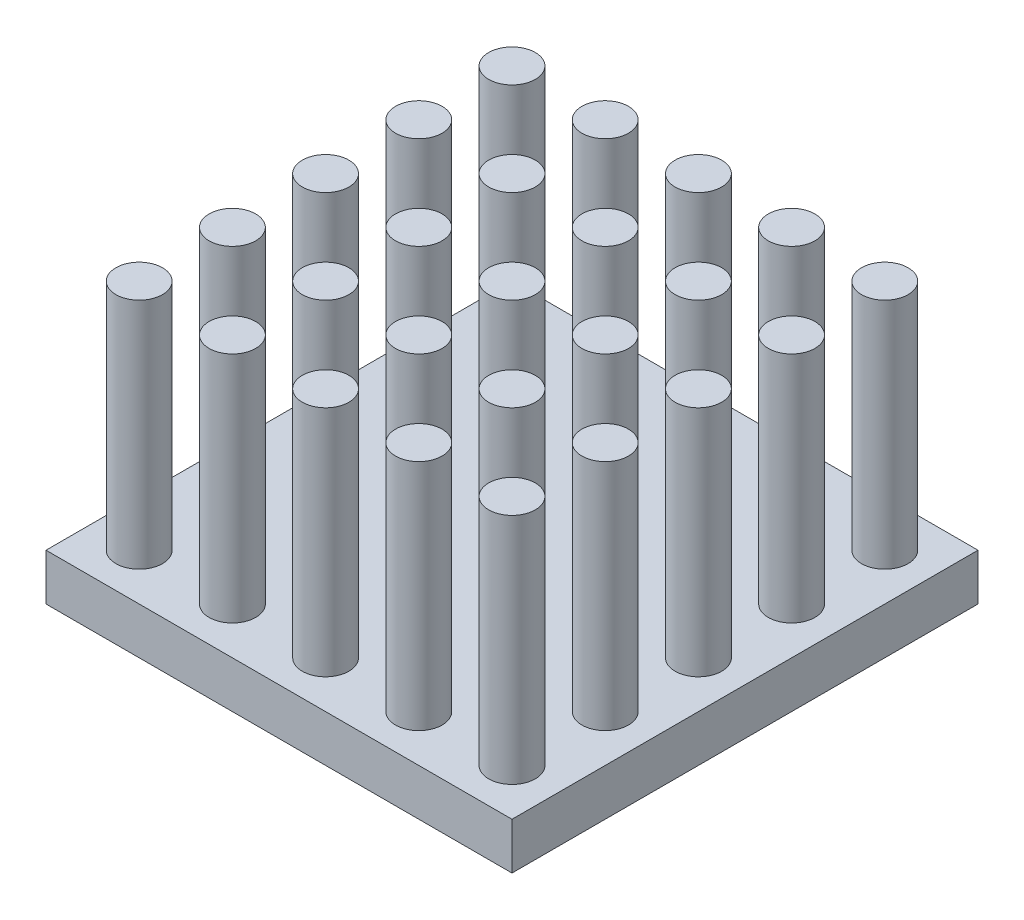
ISO-10303-21;
HEADER;
FILE_DESCRIPTION(('STEP AP214'),'2;1');
FILE_NAME('part.step','',(''),(''),'','','');
FILE_SCHEMA(('AUTOMOTIVE_DESIGN { 1 0 10303 214 1 1 1 1 }'));
ENDSEC;
DATA;
#1=APPLICATION_CONTEXT('core data for automotive mechanical design processes');
#2=APPLICATION_PROTOCOL_DEFINITION('international standard','automotive_design',2000,#1);
#3=PRODUCT_CONTEXT('',#1,'mechanical');
#4=PRODUCT('Part','Part','',(#3));
#5=PRODUCT_RELATED_PRODUCT_CATEGORY('part','',(#4));
#6=PRODUCT_DEFINITION_FORMATION('','',#4);
#7=PRODUCT_DEFINITION_CONTEXT('part definition',#1,'design');
#8=PRODUCT_DEFINITION('design','',#6,#7);
#9=PRODUCT_DEFINITION_SHAPE('','',#8);
#10=(LENGTH_UNIT() NAMED_UNIT(*) SI_UNIT(.MILLI.,.METRE.));
#11=(NAMED_UNIT(*) PLANE_ANGLE_UNIT() SI_UNIT($,.RADIAN.));
#12=(NAMED_UNIT(*) SI_UNIT($,.STERADIAN.) SOLID_ANGLE_UNIT());
#13=UNCERTAINTY_MEASURE_WITH_UNIT(LENGTH_MEASURE(1.E-05),#10,'distance_accuracy_value','');
#14=(GEOMETRIC_REPRESENTATION_CONTEXT(3) GLOBAL_UNCERTAINTY_ASSIGNED_CONTEXT((#13)) GLOBAL_UNIT_ASSIGNED_CONTEXT((#10,
#11,#12)) REPRESENTATION_CONTEXT('',''));
#15=CARTESIAN_POINT('',(0.,0.,0.));
#16=DIRECTION('',(0.,0.,1.));
#17=DIRECTION('',(1.,0.,0.));
#18=AXIS2_PLACEMENT_3D('',#15,#16,#17);
#19=CARTESIAN_POINT('',(0.,6.,4.));
#20=DIRECTION('',(0.,-1.,0.));
#21=DIRECTION('',(0.,0.,-1.));
#22=AXIS2_PLACEMENT_3D('',#19,#20,#21);
#23=CYLINDRICAL_SURFACE('',#22,0.5);
#24=CARTESIAN_POINT('',(0.,6.,4.));
#25=DIRECTION('',(0.,1.,0.));
#26=DIRECTION('',(0.,0.,1.));
#27=AXIS2_PLACEMENT_3D('',#24,#25,#26);
#28=CIRCLE('',#27,0.5);
#29=CARTESIAN_POINT('',(0.,6.,4.5));
#30=VERTEX_POINT('',#29);
#31=EDGE_CURVE('E11',#30,#30,#28,.T.);
#32=ORIENTED_EDGE('',*,*,#31,.F.);
#33=EDGE_LOOP('',(#32));
#34=FACE_BOUND('',#33,.T.);
#35=CARTESIAN_POINT('',(0.,1.,4.));
#36=DIRECTION('',(0.,-1.,0.));
#37=DIRECTION('',(0.,0.,-1.));
#38=AXIS2_PLACEMENT_3D('',#35,#36,#37);
#39=CIRCLE('',#38,0.5);
#40=CARTESIAN_POINT('',(0.,1.,3.5));
#41=VERTEX_POINT('',#40);
#42=EDGE_CURVE('E48',#41,#41,#39,.F.);
#43=ORIENTED_EDGE('',*,*,#42,.T.);
#44=EDGE_LOOP('',(#43));
#45=FACE_BOUND('',#44,.T.);
#46=ADVANCED_FACE('F40',(#34,#45),#23,.T.);
#47=CARTESIAN_POINT('',(0.,6.,4.));
#48=DIRECTION('',(0.,1.,0.));
#49=DIRECTION('',(0.,0.,1.));
#50=AXIS2_PLACEMENT_3D('',#47,#48,#49);
#51=PLANE('',#50);
#52=ORIENTED_EDGE('',*,*,#31,.T.);
#53=EDGE_LOOP('',(#52));
#54=FACE_BOUND('',#53,.T.);
#55=ADVANCED_FACE('F263',(#54),#51,.T.);
#56=CARTESIAN_POINT('',(0.,6.,2.));
#57=DIRECTION('',(0.,-1.,0.));
#58=DIRECTION('',(0.,0.,-1.));
#59=AXIS2_PLACEMENT_3D('',#56,#57,#58);
#60=CYLINDRICAL_SURFACE('',#59,0.5);
#61=CARTESIAN_POINT('',(0.,6.,2.));
#62=DIRECTION('',(0.,1.,0.));
#63=DIRECTION('',(0.,0.,1.));
#64=AXIS2_PLACEMENT_3D('',#61,#62,#63);
#65=CIRCLE('',#64,0.5);
#66=CARTESIAN_POINT('',(0.,6.,2.5));
#67=VERTEX_POINT('',#66);
#68=EDGE_CURVE('E241',#67,#67,#65,.T.);
#69=ORIENTED_EDGE('',*,*,#68,.F.);
#70=EDGE_LOOP('',(#69));
#71=FACE_BOUND('',#70,.T.);
#72=CARTESIAN_POINT('',(0.,1.,2.));
#73=DIRECTION('',(0.,-1.,0.));
#74=DIRECTION('',(0.,0.,-1.));
#75=AXIS2_PLACEMENT_3D('',#72,#73,#74);
#76=CIRCLE('',#75,0.5);
#77=CARTESIAN_POINT('',(0.,1.,1.5));
#78=VERTEX_POINT('',#77);
#79=EDGE_CURVE('E238',#78,#78,#76,.F.);
#80=ORIENTED_EDGE('',*,*,#79,.T.);
#81=EDGE_LOOP('',(#80));
#82=FACE_BOUND('',#81,.T.);
#83=ADVANCED_FACE('F268',(#71,#82),#60,.T.);
#84=CARTESIAN_POINT('',(0.,6.,2.));
#85=DIRECTION('',(0.,1.,0.));
#86=DIRECTION('',(0.,0.,1.));
#87=AXIS2_PLACEMENT_3D('',#84,#85,#86);
#88=PLANE('',#87);
#89=ORIENTED_EDGE('',*,*,#68,.T.);
#90=EDGE_LOOP('',(#89));
#91=FACE_BOUND('',#90,.T.);
#92=ADVANCED_FACE('F274',(#91),#88,.T.);
#93=CARTESIAN_POINT('',(0.,6.,0.));
#94=DIRECTION('',(0.,-1.,0.));
#95=DIRECTION('',(0.,0.,-1.));
#96=AXIS2_PLACEMENT_3D('',#93,#94,#95);
#97=CYLINDRICAL_SURFACE('',#96,0.5);
#98=CARTESIAN_POINT('',(0.,6.,0.));
#99=DIRECTION('',(0.,1.,0.));
#100=DIRECTION('',(0.,0.,1.));
#101=AXIS2_PLACEMENT_3D('',#98,#99,#100);
#102=CIRCLE('',#101,0.5);
#103=CARTESIAN_POINT('',(0.,6.,0.500000000000002));
#104=VERTEX_POINT('',#103);
#105=EDGE_CURVE('E235',#104,#104,#102,.T.);
#106=ORIENTED_EDGE('',*,*,#105,.F.);
#107=EDGE_LOOP('',(#106));
#108=FACE_BOUND('',#107,.T.);
#109=CARTESIAN_POINT('',(0.,1.,0.));
#110=DIRECTION('',(0.,-1.,0.));
#111=DIRECTION('',(0.,0.,-1.));
#112=AXIS2_PLACEMENT_3D('',#109,#110,#111);
#113=CIRCLE('',#112,0.5);
#114=CARTESIAN_POINT('',(0.,1.,-0.499999999999998));
#115=VERTEX_POINT('',#114);
#116=EDGE_CURVE('E232',#115,#115,#113,.F.);
#117=ORIENTED_EDGE('',*,*,#116,.T.);
#118=EDGE_LOOP('',(#117));
#119=FACE_BOUND('',#118,.T.);
#120=ADVANCED_FACE('F280',(#108,#119),#97,.T.);
#121=CARTESIAN_POINT('',(0.,6.,0.));
#122=DIRECTION('',(0.,1.,0.));
#123=DIRECTION('',(0.,0.,1.));
#124=AXIS2_PLACEMENT_3D('',#121,#122,#123);
#125=PLANE('',#124);
#126=ORIENTED_EDGE('',*,*,#105,.T.);
#127=EDGE_LOOP('',(#126));
#128=FACE_BOUND('',#127,.T.);
#129=ADVANCED_FACE('F284',(#128),#125,.T.);
#130=CARTESIAN_POINT('',(2.,6.,4.));
#131=DIRECTION('',(0.,-1.,0.));
#132=DIRECTION('',(0.,0.,-1.));
#133=AXIS2_PLACEMENT_3D('',#130,#131,#132);
#134=CYLINDRICAL_SURFACE('',#133,0.5);
#135=CARTESIAN_POINT('',(2.,6.,4.));
#136=DIRECTION('',(0.,1.,0.));
#137=DIRECTION('',(0.,0.,1.));
#138=AXIS2_PLACEMENT_3D('',#135,#136,#137);
#139=CIRCLE('',#138,0.5);
#140=CARTESIAN_POINT('',(2.,6.,4.5));
#141=VERTEX_POINT('',#140);
#142=EDGE_CURVE('E226',#141,#141,#139,.T.);
#143=ORIENTED_EDGE('',*,*,#142,.F.);
#144=EDGE_LOOP('',(#143));
#145=FACE_BOUND('',#144,.T.);
#146=CARTESIAN_POINT('',(2.,1.,4.));
#147=DIRECTION('',(0.,-1.,0.));
#148=DIRECTION('',(0.,0.,-1.));
#149=AXIS2_PLACEMENT_3D('',#146,#147,#148);
#150=CIRCLE('',#149,0.5);
#151=CARTESIAN_POINT('',(2.,1.,3.5));
#152=VERTEX_POINT('',#151);
#153=EDGE_CURVE('E223',#152,#152,#150,.F.);
#154=ORIENTED_EDGE('',*,*,#153,.T.);
#155=EDGE_LOOP('',(#154));
#156=FACE_BOUND('',#155,.T.);
#157=ADVANCED_FACE('F288',(#145,#156),#134,.T.);
#158=CARTESIAN_POINT('',(2.,6.,4.));
#159=DIRECTION('',(0.,1.,0.));
#160=DIRECTION('',(0.,0.,1.));
#161=AXIS2_PLACEMENT_3D('',#158,#159,#160);
#162=PLANE('',#161);
#163=ORIENTED_EDGE('',*,*,#142,.T.);
#164=EDGE_LOOP('',(#163));
#165=FACE_BOUND('',#164,.T.);
#166=ADVANCED_FACE('F292',(#165),#162,.T.);
#167=CARTESIAN_POINT('',(2.,6.,2.));
#168=DIRECTION('',(0.,-1.,0.));
#169=DIRECTION('',(0.,0.,-1.));
#170=AXIS2_PLACEMENT_3D('',#167,#168,#169);
#171=CYLINDRICAL_SURFACE('',#170,0.5);
#172=CARTESIAN_POINT('',(2.,6.,2.));
#173=DIRECTION('',(0.,1.,0.));
#174=DIRECTION('',(0.,0.,1.));
#175=AXIS2_PLACEMENT_3D('',#172,#173,#174);
#176=CIRCLE('',#175,0.5);
#177=CARTESIAN_POINT('',(2.,6.,2.5));
#178=VERTEX_POINT('',#177);
#179=EDGE_CURVE('E220',#178,#178,#176,.T.);
#180=ORIENTED_EDGE('',*,*,#179,.F.);
#181=EDGE_LOOP('',(#180));
#182=FACE_BOUND('',#181,.T.);
#183=CARTESIAN_POINT('',(2.,1.,2.));
#184=DIRECTION('',(0.,-1.,0.));
#185=DIRECTION('',(0.,0.,-1.));
#186=AXIS2_PLACEMENT_3D('',#183,#184,#185);
#187=CIRCLE('',#186,0.5);
#188=CARTESIAN_POINT('',(2.,1.,1.5));
#189=VERTEX_POINT('',#188);
#190=EDGE_CURVE('E217',#189,#189,#187,.F.);
#191=ORIENTED_EDGE('',*,*,#190,.T.);
#192=EDGE_LOOP('',(#191));
#193=FACE_BOUND('',#192,.T.);
#194=ADVANCED_FACE('F296',(#182,#193),#171,.T.);
#195=CARTESIAN_POINT('',(2.,6.,2.));
#196=DIRECTION('',(0.,1.,0.));
#197=DIRECTION('',(0.,0.,1.));
#198=AXIS2_PLACEMENT_3D('',#195,#196,#197);
#199=PLANE('',#198);
#200=ORIENTED_EDGE('',*,*,#179,.T.);
#201=EDGE_LOOP('',(#200));
#202=FACE_BOUND('',#201,.T.);
#203=ADVANCED_FACE('F300',(#202),#199,.T.);
#204=CARTESIAN_POINT('',(2.,6.,0.));
#205=DIRECTION('',(0.,-1.,0.));
#206=DIRECTION('',(0.,0.,-1.));
#207=AXIS2_PLACEMENT_3D('',#204,#205,#206);
#208=CYLINDRICAL_SURFACE('',#207,0.5);
#209=CARTESIAN_POINT('',(2.,6.,0.));
#210=DIRECTION('',(0.,1.,0.));
#211=DIRECTION('',(0.,0.,1.));
#212=AXIS2_PLACEMENT_3D('',#209,#210,#211);
#213=CIRCLE('',#212,0.5);
#214=CARTESIAN_POINT('',(2.,6.,0.500000000000002));
#215=VERTEX_POINT('',#214);
#216=EDGE_CURVE('E214',#215,#215,#213,.T.);
#217=ORIENTED_EDGE('',*,*,#216,.F.);
#218=EDGE_LOOP('',(#217));
#219=FACE_BOUND('',#218,.T.);
#220=CARTESIAN_POINT('',(2.,1.,0.));
#221=DIRECTION('',(0.,-1.,0.));
#222=DIRECTION('',(0.,0.,-1.));
#223=AXIS2_PLACEMENT_3D('',#220,#221,#222);
#224=CIRCLE('',#223,0.5);
#225=CARTESIAN_POINT('',(2.,1.,-0.499999999999998));
#226=VERTEX_POINT('',#225);
#227=EDGE_CURVE('E211',#226,#226,#224,.F.);
#228=ORIENTED_EDGE('',*,*,#227,.T.);
#229=EDGE_LOOP('',(#228));
#230=FACE_BOUND('',#229,.T.);
#231=ADVANCED_FACE('F304',(#219,#230),#208,.T.);
#232=CARTESIAN_POINT('',(2.,6.,0.));
#233=DIRECTION('',(0.,1.,0.));
#234=DIRECTION('',(0.,0.,1.));
#235=AXIS2_PLACEMENT_3D('',#232,#233,#234);
#236=PLANE('',#235);
#237=ORIENTED_EDGE('',*,*,#216,.T.);
#238=EDGE_LOOP('',(#237));
#239=FACE_BOUND('',#238,.T.);
#240=ADVANCED_FACE('F308',(#239),#236,.T.);
#241=CARTESIAN_POINT('',(4.,6.,4.));
#242=DIRECTION('',(0.,-1.,0.));
#243=DIRECTION('',(0.,0.,-1.));
#244=AXIS2_PLACEMENT_3D('',#241,#242,#243);
#245=CYLINDRICAL_SURFACE('',#244,0.5);
#246=CARTESIAN_POINT('',(4.,6.,4.));
#247=DIRECTION('',(0.,1.,0.));
#248=DIRECTION('',(0.,0.,1.));
#249=AXIS2_PLACEMENT_3D('',#246,#247,#248);
#250=CIRCLE('',#249,0.5);
#251=CARTESIAN_POINT('',(4.,6.,4.5));
#252=VERTEX_POINT('',#251);
#253=EDGE_CURVE('E205',#252,#252,#250,.T.);
#254=ORIENTED_EDGE('',*,*,#253,.F.);
#255=EDGE_LOOP('',(#254));
#256=FACE_BOUND('',#255,.T.);
#257=CARTESIAN_POINT('',(4.,1.,4.));
#258=DIRECTION('',(0.,-1.,0.));
#259=DIRECTION('',(0.,0.,-1.));
#260=AXIS2_PLACEMENT_3D('',#257,#258,#259);
#261=CIRCLE('',#260,0.5);
#262=CARTESIAN_POINT('',(4.,1.,3.5));
#263=VERTEX_POINT('',#262);
#264=EDGE_CURVE('E202',#263,#263,#261,.F.);
#265=ORIENTED_EDGE('',*,*,#264,.T.);
#266=EDGE_LOOP('',(#265));
#267=FACE_BOUND('',#266,.T.);
#268=ADVANCED_FACE('F312',(#256,#267),#245,.T.);
#269=CARTESIAN_POINT('',(4.,6.,4.));
#270=DIRECTION('',(0.,1.,0.));
#271=DIRECTION('',(0.,0.,1.));
#272=AXIS2_PLACEMENT_3D('',#269,#270,#271);
#273=PLANE('',#272);
#274=ORIENTED_EDGE('',*,*,#253,.T.);
#275=EDGE_LOOP('',(#274));
#276=FACE_BOUND('',#275,.T.);
#277=ADVANCED_FACE('F316',(#276),#273,.T.);
#278=CARTESIAN_POINT('',(4.,6.,2.));
#279=DIRECTION('',(0.,-1.,0.));
#280=DIRECTION('',(0.,0.,-1.));
#281=AXIS2_PLACEMENT_3D('',#278,#279,#280);
#282=CYLINDRICAL_SURFACE('',#281,0.5);
#283=CARTESIAN_POINT('',(4.,6.,2.));
#284=DIRECTION('',(0.,1.,0.));
#285=DIRECTION('',(0.,0.,1.));
#286=AXIS2_PLACEMENT_3D('',#283,#284,#285);
#287=CIRCLE('',#286,0.5);
#288=CARTESIAN_POINT('',(4.,6.,2.5));
#289=VERTEX_POINT('',#288);
#290=EDGE_CURVE('E199',#289,#289,#287,.T.);
#291=ORIENTED_EDGE('',*,*,#290,.F.);
#292=EDGE_LOOP('',(#291));
#293=FACE_BOUND('',#292,.T.);
#294=CARTESIAN_POINT('',(4.,1.,2.));
#295=DIRECTION('',(0.,-1.,0.));
#296=DIRECTION('',(0.,0.,-1.));
#297=AXIS2_PLACEMENT_3D('',#294,#295,#296);
#298=CIRCLE('',#297,0.5);
#299=CARTESIAN_POINT('',(4.,1.,1.5));
#300=VERTEX_POINT('',#299);
#301=EDGE_CURVE('E196',#300,#300,#298,.F.);
#302=ORIENTED_EDGE('',*,*,#301,.T.);
#303=EDGE_LOOP('',(#302));
#304=FACE_BOUND('',#303,.T.);
#305=ADVANCED_FACE('F320',(#293,#304),#282,.T.);
#306=CARTESIAN_POINT('',(4.,6.,2.));
#307=DIRECTION('',(0.,1.,0.));
#308=DIRECTION('',(0.,0.,1.));
#309=AXIS2_PLACEMENT_3D('',#306,#307,#308);
#310=PLANE('',#309);
#311=ORIENTED_EDGE('',*,*,#290,.T.);
#312=EDGE_LOOP('',(#311));
#313=FACE_BOUND('',#312,.T.);
#314=ADVANCED_FACE('F324',(#313),#310,.T.);
#315=CARTESIAN_POINT('',(4.,6.,0.));
#316=DIRECTION('',(0.,-1.,0.));
#317=DIRECTION('',(0.,0.,-1.));
#318=AXIS2_PLACEMENT_3D('',#315,#316,#317);
#319=CYLINDRICAL_SURFACE('',#318,0.5);
#320=CARTESIAN_POINT('',(4.,6.,0.));
#321=DIRECTION('',(0.,1.,0.));
#322=DIRECTION('',(0.,0.,1.));
#323=AXIS2_PLACEMENT_3D('',#320,#321,#322);
#324=CIRCLE('',#323,0.5);
#325=CARTESIAN_POINT('',(4.,6.,0.500000000000002));
#326=VERTEX_POINT('',#325);
#327=EDGE_CURVE('E193',#326,#326,#324,.T.);
#328=ORIENTED_EDGE('',*,*,#327,.F.);
#329=EDGE_LOOP('',(#328));
#330=FACE_BOUND('',#329,.T.);
#331=CARTESIAN_POINT('',(4.,1.,0.));
#332=DIRECTION('',(0.,-1.,0.));
#333=DIRECTION('',(0.,0.,-1.));
#334=AXIS2_PLACEMENT_3D('',#331,#332,#333);
#335=CIRCLE('',#334,0.5);
#336=CARTESIAN_POINT('',(4.,1.,-0.499999999999998));
#337=VERTEX_POINT('',#336);
#338=EDGE_CURVE('E190',#337,#337,#335,.F.);
#339=ORIENTED_EDGE('',*,*,#338,.T.);
#340=EDGE_LOOP('',(#339));
#341=FACE_BOUND('',#340,.T.);
#342=ADVANCED_FACE('F328',(#330,#341),#319,.T.);
#343=CARTESIAN_POINT('',(4.,6.,0.));
#344=DIRECTION('',(0.,1.,0.));
#345=DIRECTION('',(0.,0.,1.));
#346=AXIS2_PLACEMENT_3D('',#343,#344,#345);
#347=PLANE('',#346);
#348=ORIENTED_EDGE('',*,*,#327,.T.);
#349=EDGE_LOOP('',(#348));
#350=FACE_BOUND('',#349,.T.);
#351=ADVANCED_FACE('F332',(#350),#347,.T.);
#352=CARTESIAN_POINT('',(-4.,6.,4.));
#353=DIRECTION('',(0.,1.,0.));
#354=DIRECTION('',(0.,0.,1.));
#355=AXIS2_PLACEMENT_3D('',#352,#353,#354);
#356=PLANE('',#355);
#357=CARTESIAN_POINT('',(-4.,6.,4.));
#358=DIRECTION('',(0.,1.,0.));
#359=DIRECTION('',(0.,0.,1.));
#360=AXIS2_PLACEMENT_3D('',#357,#358,#359);
#361=CIRCLE('',#360,0.5);
#362=CARTESIAN_POINT('',(-4.,6.,4.5));
#363=VERTEX_POINT('',#362);
#364=EDGE_CURVE('E184',#363,#363,#361,.T.);
#365=ORIENTED_EDGE('',*,*,#364,.T.);
#366=EDGE_LOOP('',(#365));
#367=FACE_BOUND('',#366,.T.);
#368=ADVANCED_FACE('F336',(#367),#356,.T.);
#369=CARTESIAN_POINT('',(-4.,6.,4.));
#370=DIRECTION('',(0.,-1.,0.));
#371=DIRECTION('',(0.,0.,-1.));
#372=AXIS2_PLACEMENT_3D('',#369,#370,#371);
#373=CYLINDRICAL_SURFACE('',#372,0.5);
#374=ORIENTED_EDGE('',*,*,#364,.F.);
#375=EDGE_LOOP('',(#374));
#376=FACE_BOUND('',#375,.T.);
#377=CARTESIAN_POINT('',(-4.,1.,4.));
#378=DIRECTION('',(0.,-1.,0.));
#379=DIRECTION('',(0.,0.,-1.));
#380=AXIS2_PLACEMENT_3D('',#377,#378,#379);
#381=CIRCLE('',#380,0.5);
#382=CARTESIAN_POINT('',(-4.,1.,3.5));
#383=VERTEX_POINT('',#382);
#384=EDGE_CURVE('E181',#383,#383,#381,.F.);
#385=ORIENTED_EDGE('',*,*,#384,.T.);
#386=EDGE_LOOP('',(#385));
#387=FACE_BOUND('',#386,.T.);
#388=ADVANCED_FACE('F340',(#376,#387),#373,.T.);
#389=CARTESIAN_POINT('',(-4.,6.,2.));
#390=DIRECTION('',(0.,1.,0.));
#391=DIRECTION('',(0.,0.,1.));
#392=AXIS2_PLACEMENT_3D('',#389,#390,#391);
#393=PLANE('',#392);
#394=CARTESIAN_POINT('',(-4.,6.,2.));
#395=DIRECTION('',(0.,1.,0.));
#396=DIRECTION('',(0.,0.,1.));
#397=AXIS2_PLACEMENT_3D('',#394,#395,#396);
#398=CIRCLE('',#397,0.5);
#399=CARTESIAN_POINT('',(-4.,6.,2.5));
#400=VERTEX_POINT('',#399);
#401=EDGE_CURVE('E178',#400,#400,#398,.T.);
#402=ORIENTED_EDGE('',*,*,#401,.T.);
#403=EDGE_LOOP('',(#402));
#404=FACE_BOUND('',#403,.T.);
#405=ADVANCED_FACE('F344',(#404),#393,.T.);
#406=CARTESIAN_POINT('',(-4.,6.,2.));
#407=DIRECTION('',(0.,-1.,0.));
#408=DIRECTION('',(0.,0.,-1.));
#409=AXIS2_PLACEMENT_3D('',#406,#407,#408);
#410=CYLINDRICAL_SURFACE('',#409,0.5);
#411=ORIENTED_EDGE('',*,*,#401,.F.);
#412=EDGE_LOOP('',(#411));
#413=FACE_BOUND('',#412,.T.);
#414=CARTESIAN_POINT('',(-4.,1.,2.));
#415=DIRECTION('',(0.,-1.,0.));
#416=DIRECTION('',(0.,0.,-1.));
#417=AXIS2_PLACEMENT_3D('',#414,#415,#416);
#418=CIRCLE('',#417,0.5);
#419=CARTESIAN_POINT('',(-4.,1.,1.5));
#420=VERTEX_POINT('',#419);
#421=EDGE_CURVE('E175',#420,#420,#418,.F.);
#422=ORIENTED_EDGE('',*,*,#421,.T.);
#423=EDGE_LOOP('',(#422));
#424=FACE_BOUND('',#423,.T.);
#425=ADVANCED_FACE('F348',(#413,#424),#410,.T.);
#426=CARTESIAN_POINT('',(-4.,6.,0.));
#427=DIRECTION('',(0.,1.,0.));
#428=DIRECTION('',(0.,0.,1.));
#429=AXIS2_PLACEMENT_3D('',#426,#427,#428);
#430=PLANE('',#429);
#431=CARTESIAN_POINT('',(-4.,6.,0.));
#432=DIRECTION('',(0.,1.,0.));
#433=DIRECTION('',(0.,0.,1.));
#434=AXIS2_PLACEMENT_3D('',#431,#432,#433);
#435=CIRCLE('',#434,0.5);
#436=CARTESIAN_POINT('',(-4.,6.,0.500000000000002));
#437=VERTEX_POINT('',#436);
#438=EDGE_CURVE('E172',#437,#437,#435,.T.);
#439=ORIENTED_EDGE('',*,*,#438,.T.);
#440=EDGE_LOOP('',(#439));
#441=FACE_BOUND('',#440,.T.);
#442=ADVANCED_FACE('F352',(#441),#430,.T.);
#443=CARTESIAN_POINT('',(-4.,6.,0.));
#444=DIRECTION('',(0.,-1.,0.));
#445=DIRECTION('',(0.,0.,-1.));
#446=AXIS2_PLACEMENT_3D('',#443,#444,#445);
#447=CYLINDRICAL_SURFACE('',#446,0.5);
#448=ORIENTED_EDGE('',*,*,#438,.F.);
#449=EDGE_LOOP('',(#448));
#450=FACE_BOUND('',#449,.T.);
#451=CARTESIAN_POINT('',(-4.,1.,0.));
#452=DIRECTION('',(0.,-1.,0.));
#453=DIRECTION('',(0.,0.,-1.));
#454=AXIS2_PLACEMENT_3D('',#451,#452,#453);
#455=CIRCLE('',#454,0.5);
#456=CARTESIAN_POINT('',(-4.,1.,-0.499999999999998));
#457=VERTEX_POINT('',#456);
#458=EDGE_CURVE('E169',#457,#457,#455,.F.);
#459=ORIENTED_EDGE('',*,*,#458,.T.);
#460=EDGE_LOOP('',(#459));
#461=FACE_BOUND('',#460,.T.);
#462=ADVANCED_FACE('F356',(#450,#461),#447,.T.);
#463=CARTESIAN_POINT('',(-2.,6.,4.));
#464=DIRECTION('',(0.,1.,0.));
#465=DIRECTION('',(0.,0.,1.));
#466=AXIS2_PLACEMENT_3D('',#463,#464,#465);
#467=PLANE('',#466);
#468=CARTESIAN_POINT('',(-2.,6.,4.));
#469=DIRECTION('',(0.,1.,0.));
#470=DIRECTION('',(0.,0.,1.));
#471=AXIS2_PLACEMENT_3D('',#468,#469,#470);
#472=CIRCLE('',#471,0.5);
#473=CARTESIAN_POINT('',(-2.,6.,4.5));
#474=VERTEX_POINT('',#473);
#475=EDGE_CURVE('E163',#474,#474,#472,.T.);
#476=ORIENTED_EDGE('',*,*,#475,.T.);
#477=EDGE_LOOP('',(#476));
#478=FACE_BOUND('',#477,.T.);
#479=ADVANCED_FACE('F360',(#478),#467,.T.);
#480=CARTESIAN_POINT('',(-2.,6.,4.));
#481=DIRECTION('',(0.,-1.,0.));
#482=DIRECTION('',(0.,0.,-1.));
#483=AXIS2_PLACEMENT_3D('',#480,#481,#482);
#484=CYLINDRICAL_SURFACE('',#483,0.5);
#485=ORIENTED_EDGE('',*,*,#475,.F.);
#486=EDGE_LOOP('',(#485));
#487=FACE_BOUND('',#486,.T.);
#488=CARTESIAN_POINT('',(-2.,1.,4.));
#489=DIRECTION('',(0.,-1.,0.));
#490=DIRECTION('',(0.,0.,-1.));
#491=AXIS2_PLACEMENT_3D('',#488,#489,#490);
#492=CIRCLE('',#491,0.5);
#493=CARTESIAN_POINT('',(-2.,1.,3.5));
#494=VERTEX_POINT('',#493);
#495=EDGE_CURVE('E160',#494,#494,#492,.F.);
#496=ORIENTED_EDGE('',*,*,#495,.T.);
#497=EDGE_LOOP('',(#496));
#498=FACE_BOUND('',#497,.T.);
#499=ADVANCED_FACE('F364',(#487,#498),#484,.T.);
#500=CARTESIAN_POINT('',(-2.,6.,2.));
#501=DIRECTION('',(0.,1.,0.));
#502=DIRECTION('',(0.,0.,1.));
#503=AXIS2_PLACEMENT_3D('',#500,#501,#502);
#504=PLANE('',#503);
#505=CARTESIAN_POINT('',(-2.,6.,2.));
#506=DIRECTION('',(0.,1.,0.));
#507=DIRECTION('',(0.,0.,1.));
#508=AXIS2_PLACEMENT_3D('',#505,#506,#507);
#509=CIRCLE('',#508,0.5);
#510=CARTESIAN_POINT('',(-2.,6.,2.5));
#511=VERTEX_POINT('',#510);
#512=EDGE_CURVE('E157',#511,#511,#509,.T.);
#513=ORIENTED_EDGE('',*,*,#512,.T.);
#514=EDGE_LOOP('',(#513));
#515=FACE_BOUND('',#514,.T.);
#516=ADVANCED_FACE('F368',(#515),#504,.T.);
#517=CARTESIAN_POINT('',(-2.,6.,2.));
#518=DIRECTION('',(0.,-1.,0.));
#519=DIRECTION('',(0.,0.,-1.));
#520=AXIS2_PLACEMENT_3D('',#517,#518,#519);
#521=CYLINDRICAL_SURFACE('',#520,0.5);
#522=ORIENTED_EDGE('',*,*,#512,.F.);
#523=EDGE_LOOP('',(#522));
#524=FACE_BOUND('',#523,.T.);
#525=CARTESIAN_POINT('',(-2.,1.,2.));
#526=DIRECTION('',(0.,-1.,0.));
#527=DIRECTION('',(0.,0.,-1.));
#528=AXIS2_PLACEMENT_3D('',#525,#526,#527);
#529=CIRCLE('',#528,0.5);
#530=CARTESIAN_POINT('',(-2.,1.,1.5));
#531=VERTEX_POINT('',#530);
#532=EDGE_CURVE('E154',#531,#531,#529,.F.);
#533=ORIENTED_EDGE('',*,*,#532,.T.);
#534=EDGE_LOOP('',(#533));
#535=FACE_BOUND('',#534,.T.);
#536=ADVANCED_FACE('F372',(#524,#535),#521,.T.);
#537=CARTESIAN_POINT('',(-2.,6.,0.));
#538=DIRECTION('',(0.,1.,0.));
#539=DIRECTION('',(0.,0.,1.));
#540=AXIS2_PLACEMENT_3D('',#537,#538,#539);
#541=PLANE('',#540);
#542=CARTESIAN_POINT('',(-2.,6.,0.));
#543=DIRECTION('',(0.,1.,0.));
#544=DIRECTION('',(0.,0.,1.));
#545=AXIS2_PLACEMENT_3D('',#542,#543,#544);
#546=CIRCLE('',#545,0.5);
#547=CARTESIAN_POINT('',(-2.,6.,0.500000000000002));
#548=VERTEX_POINT('',#547);
#549=EDGE_CURVE('E151',#548,#548,#546,.T.);
#550=ORIENTED_EDGE('',*,*,#549,.T.);
#551=EDGE_LOOP('',(#550));
#552=FACE_BOUND('',#551,.T.);
#553=ADVANCED_FACE('F376',(#552),#541,.T.);
#554=CARTESIAN_POINT('',(-2.,6.,0.));
#555=DIRECTION('',(0.,-1.,0.));
#556=DIRECTION('',(0.,0.,-1.));
#557=AXIS2_PLACEMENT_3D('',#554,#555,#556);
#558=CYLINDRICAL_SURFACE('',#557,0.5);
#559=ORIENTED_EDGE('',*,*,#549,.F.);
#560=EDGE_LOOP('',(#559));
#561=FACE_BOUND('',#560,.T.);
#562=CARTESIAN_POINT('',(-2.,1.,0.));
#563=DIRECTION('',(0.,-1.,0.));
#564=DIRECTION('',(0.,0.,-1.));
#565=AXIS2_PLACEMENT_3D('',#562,#563,#564);
#566=CIRCLE('',#565,0.5);
#567=CARTESIAN_POINT('',(-2.,1.,-0.499999999999998));
#568=VERTEX_POINT('',#567);
#569=EDGE_CURVE('E148',#568,#568,#566,.F.);
#570=ORIENTED_EDGE('',*,*,#569,.T.);
#571=EDGE_LOOP('',(#570));
#572=FACE_BOUND('',#571,.T.);
#573=ADVANCED_FACE('F380',(#561,#572),#558,.T.);
#574=CARTESIAN_POINT('',(4.,6.,-4.));
#575=DIRECTION('',(0.,1.,0.));
#576=DIRECTION('',(0.,0.,1.));
#577=AXIS2_PLACEMENT_3D('',#574,#575,#576);
#578=PLANE('',#577);
#579=CARTESIAN_POINT('',(4.,6.,-4.));
#580=DIRECTION('',(0.,1.,0.));
#581=DIRECTION('',(0.,0.,1.));
#582=AXIS2_PLACEMENT_3D('',#579,#580,#581);
#583=CIRCLE('',#582,0.5);
#584=CARTESIAN_POINT('',(4.,6.,-3.5));
#585=VERTEX_POINT('',#584);
#586=EDGE_CURVE('E142',#585,#585,#583,.T.);
#587=ORIENTED_EDGE('',*,*,#586,.T.);
#588=EDGE_LOOP('',(#587));
#589=FACE_BOUND('',#588,.T.);
#590=ADVANCED_FACE('F384',(#589),#578,.T.);
#591=CARTESIAN_POINT('',(4.,6.,-4.));
#592=DIRECTION('',(0.,-1.,0.));
#593=DIRECTION('',(0.,0.,-1.));
#594=AXIS2_PLACEMENT_3D('',#591,#592,#593);
#595=CYLINDRICAL_SURFACE('',#594,0.5);
#596=ORIENTED_EDGE('',*,*,#586,.F.);
#597=EDGE_LOOP('',(#596));
#598=FACE_BOUND('',#597,.T.);
#599=CARTESIAN_POINT('',(4.,1.,-4.));
#600=DIRECTION('',(0.,-1.,0.));
#601=DIRECTION('',(0.,0.,-1.));
#602=AXIS2_PLACEMENT_3D('',#599,#600,#601);
#603=CIRCLE('',#602,0.5);
#604=CARTESIAN_POINT('',(4.,1.,-4.5));
#605=VERTEX_POINT('',#604);
#606=EDGE_CURVE('E139',#605,#605,#603,.F.);
#607=ORIENTED_EDGE('',*,*,#606,.T.);
#608=EDGE_LOOP('',(#607));
#609=FACE_BOUND('',#608,.T.);
#610=ADVANCED_FACE('F388',(#598,#609),#595,.T.);
#611=CARTESIAN_POINT('',(2.,6.,-4.));
#612=DIRECTION('',(0.,1.,0.));
#613=DIRECTION('',(0.,0.,1.));
#614=AXIS2_PLACEMENT_3D('',#611,#612,#613);
#615=PLANE('',#614);
#616=CARTESIAN_POINT('',(2.,6.,-4.));
#617=DIRECTION('',(0.,1.,0.));
#618=DIRECTION('',(0.,0.,1.));
#619=AXIS2_PLACEMENT_3D('',#616,#617,#618);
#620=CIRCLE('',#619,0.5);
#621=CARTESIAN_POINT('',(2.,6.,-3.5));
#622=VERTEX_POINT('',#621);
#623=EDGE_CURVE('E136',#622,#622,#620,.T.);
#624=ORIENTED_EDGE('',*,*,#623,.T.);
#625=EDGE_LOOP('',(#624));
#626=FACE_BOUND('',#625,.T.);
#627=ADVANCED_FACE('F392',(#626),#615,.T.);
#628=CARTESIAN_POINT('',(2.,6.,-4.));
#629=DIRECTION('',(0.,-1.,0.));
#630=DIRECTION('',(0.,0.,-1.));
#631=AXIS2_PLACEMENT_3D('',#628,#629,#630);
#632=CYLINDRICAL_SURFACE('',#631,0.5);
#633=ORIENTED_EDGE('',*,*,#623,.F.);
#634=EDGE_LOOP('',(#633));
#635=FACE_BOUND('',#634,.T.);
#636=CARTESIAN_POINT('',(2.,1.,-4.));
#637=DIRECTION('',(0.,-1.,0.));
#638=DIRECTION('',(0.,0.,-1.));
#639=AXIS2_PLACEMENT_3D('',#636,#637,#638);
#640=CIRCLE('',#639,0.5);
#641=CARTESIAN_POINT('',(2.,1.,-4.5));
#642=VERTEX_POINT('',#641);
#643=EDGE_CURVE('E133',#642,#642,#640,.F.);
#644=ORIENTED_EDGE('',*,*,#643,.T.);
#645=EDGE_LOOP('',(#644));
#646=FACE_BOUND('',#645,.T.);
#647=ADVANCED_FACE('F396',(#635,#646),#632,.T.);
#648=CARTESIAN_POINT('',(0.,6.,-4.));
#649=DIRECTION('',(0.,1.,0.));
#650=DIRECTION('',(0.,0.,1.));
#651=AXIS2_PLACEMENT_3D('',#648,#649,#650);
#652=PLANE('',#651);
#653=CARTESIAN_POINT('',(0.,6.,-4.));
#654=DIRECTION('',(0.,1.,0.));
#655=DIRECTION('',(0.,0.,1.));
#656=AXIS2_PLACEMENT_3D('',#653,#654,#655);
#657=CIRCLE('',#656,0.5);
#658=CARTESIAN_POINT('',(0.,6.,-3.5));
#659=VERTEX_POINT('',#658);
#660=EDGE_CURVE('E130',#659,#659,#657,.T.);
#661=ORIENTED_EDGE('',*,*,#660,.T.);
#662=EDGE_LOOP('',(#661));
#663=FACE_BOUND('',#662,.T.);
#664=ADVANCED_FACE('F400',(#663),#652,.T.);
#665=CARTESIAN_POINT('',(0.,6.,-4.));
#666=DIRECTION('',(0.,-1.,0.));
#667=DIRECTION('',(0.,0.,-1.));
#668=AXIS2_PLACEMENT_3D('',#665,#666,#667);
#669=CYLINDRICAL_SURFACE('',#668,0.5);
#670=ORIENTED_EDGE('',*,*,#660,.F.);
#671=EDGE_LOOP('',(#670));
#672=FACE_BOUND('',#671,.T.);
#673=CARTESIAN_POINT('',(0.,1.,-4.));
#674=DIRECTION('',(0.,-1.,0.));
#675=DIRECTION('',(0.,0.,-1.));
#676=AXIS2_PLACEMENT_3D('',#673,#674,#675);
#677=CIRCLE('',#676,0.5);
#678=CARTESIAN_POINT('',(0.,1.,-4.5));
#679=VERTEX_POINT('',#678);
#680=EDGE_CURVE('E127',#679,#679,#677,.F.);
#681=ORIENTED_EDGE('',*,*,#680,.T.);
#682=EDGE_LOOP('',(#681));
#683=FACE_BOUND('',#682,.T.);
#684=ADVANCED_FACE('F404',(#672,#683),#669,.T.);
#685=CARTESIAN_POINT('',(-5.,1.,-5.));
#686=DIRECTION('',(0.,0.,-1.));
#687=DIRECTION('',(-1.,0.,0.));
#688=AXIS2_PLACEMENT_3D('',#685,#686,#687);
#689=PLANE('',#688);
#690=DIRECTION('',(1.,0.,0.));
#691=VECTOR('',#690,1.);
#692=CARTESIAN_POINT('',(-5.,0.,-5.));
#693=LINE('',#692,#691);
#694=CARTESIAN_POINT('',(-5.,0.,-5.));
#695=VERTEX_POINT('',#694);
#696=CARTESIAN_POINT('',(5.,0.,-5.));
#697=VERTEX_POINT('',#696);
#698=EDGE_CURVE('E110',#695,#697,#693,.T.);
#699=ORIENTED_EDGE('',*,*,#698,.F.);
#700=DIRECTION('',(0.,-1.,0.));
#701=VECTOR('',#700,1.);
#702=CARTESIAN_POINT('',(-5.,1.,-5.));
#703=LINE('',#702,#701);
#704=CARTESIAN_POINT('',(-5.,1.,-5.));
#705=VERTEX_POINT('',#704);
#706=EDGE_CURVE('E56',#705,#695,#703,.T.);
#707=ORIENTED_EDGE('',*,*,#706,.F.);
#708=DIRECTION('',(1.,0.,0.));
#709=VECTOR('',#708,1.);
#710=CARTESIAN_POINT('',(-5.,1.,-5.));
#711=LINE('',#710,#709);
#712=CARTESIAN_POINT('',(5.,1.,-5.));
#713=VERTEX_POINT('',#712);
#714=EDGE_CURVE('E104',#705,#713,#711,.T.);
#715=ORIENTED_EDGE('',*,*,#714,.T.);
#716=DIRECTION('',(0.,-1.,0.));
#717=VECTOR('',#716,1.);
#718=CARTESIAN_POINT('',(5.,1.,-5.));
#719=LINE('',#718,#717);
#720=EDGE_CURVE('E81',#713,#697,#719,.T.);
#721=ORIENTED_EDGE('',*,*,#720,.T.);
#722=EDGE_LOOP('',(#699,#707,#715,#721));
#723=FACE_BOUND('',#722,.T.);
#724=ADVANCED_FACE('F408',(#723),#689,.T.);
#725=CARTESIAN_POINT('',(-5.,1.,-5.));
#726=DIRECTION('',(1.,0.,0.));
#727=DIRECTION('',(0.,0.,-1.));
#728=AXIS2_PLACEMENT_3D('',#725,#726,#727);
#729=PLANE('',#728);
#730=DIRECTION('',(0.,0.,1.));
#731=VECTOR('',#730,1.);
#732=CARTESIAN_POINT('',(-5.,0.,-5.));
#733=LINE('',#732,#731);
#734=CARTESIAN_POINT('',(-5.,0.,5.));
#735=VERTEX_POINT('',#734);
#736=EDGE_CURVE('E73',#695,#735,#733,.T.);
#737=ORIENTED_EDGE('',*,*,#736,.T.);
#738=DIRECTION('',(0.,-1.,0.));
#739=VECTOR('',#738,1.);
#740=CARTESIAN_POINT('',(-5.,1.,5.));
#741=LINE('',#740,#739);
#742=CARTESIAN_POINT('',(-5.,1.,5.));
#743=VERTEX_POINT('',#742);
#744=EDGE_CURVE('E101',#743,#735,#741,.T.);
#745=ORIENTED_EDGE('',*,*,#744,.F.);
#746=DIRECTION('',(0.,0.,1.));
#747=VECTOR('',#746,1.);
#748=CARTESIAN_POINT('',(-5.,1.,-5.));
#749=LINE('',#748,#747);
#750=EDGE_CURVE('E92',#705,#743,#749,.T.);
#751=ORIENTED_EDGE('',*,*,#750,.F.);
#752=ORIENTED_EDGE('',*,*,#706,.T.);
#753=EDGE_LOOP('',(#737,#745,#751,#752));
#754=FACE_BOUND('',#753,.T.);
#755=ADVANCED_FACE('F411',(#754),#729,.F.);
#756=CARTESIAN_POINT('',(-5.,1.,5.));
#757=DIRECTION('',(0.,0.,-1.));
#758=DIRECTION('',(-1.,0.,0.));
#759=AXIS2_PLACEMENT_3D('',#756,#757,#758);
#760=PLANE('',#759);
#761=DIRECTION('',(1.,0.,0.));
#762=VECTOR('',#761,1.);
#763=CARTESIAN_POINT('',(-5.,0.,5.));
#764=LINE('',#763,#762);
#765=CARTESIAN_POINT('',(5.,0.,5.));
#766=VERTEX_POINT('',#765);
#767=EDGE_CURVE('E99',#735,#766,#764,.T.);
#768=ORIENTED_EDGE('',*,*,#767,.T.);
#769=DIRECTION('',(0.,-1.,0.));
#770=VECTOR('',#769,1.);
#771=CARTESIAN_POINT('',(5.,1.,5.));
#772=LINE('',#771,#770);
#773=CARTESIAN_POINT('',(5.,1.,5.));
#774=VERTEX_POINT('',#773);
#775=EDGE_CURVE('E96',#774,#766,#772,.T.);
#776=ORIENTED_EDGE('',*,*,#775,.F.);
#777=DIRECTION('',(1.,0.,0.));
#778=VECTOR('',#777,1.);
#779=CARTESIAN_POINT('',(-5.,1.,5.));
#780=LINE('',#779,#778);
#781=EDGE_CURVE('E86',#743,#774,#780,.T.);
#782=ORIENTED_EDGE('',*,*,#781,.F.);
#783=ORIENTED_EDGE('',*,*,#744,.T.);
#784=EDGE_LOOP('',(#768,#776,#782,#783));
#785=FACE_BOUND('',#784,.T.);
#786=ADVANCED_FACE('F97',(#785),#760,.F.);
#787=CARTESIAN_POINT('',(5.,1.,-5.));
#788=DIRECTION('',(1.,0.,0.));
#789=DIRECTION('',(0.,0.,-1.));
#790=AXIS2_PLACEMENT_3D('',#787,#788,#789);
#791=PLANE('',#790);
#792=DIRECTION('',(0.,0.,1.));
#793=VECTOR('',#792,1.);
#794=CARTESIAN_POINT('',(5.,0.,-5.));
#795=LINE('',#794,#793);
#796=EDGE_CURVE('E113',#697,#766,#795,.T.);
#797=ORIENTED_EDGE('',*,*,#796,.F.);
#798=ORIENTED_EDGE('',*,*,#720,.F.);
#799=DIRECTION('',(0.,0.,1.));
#800=VECTOR('',#799,1.);
#801=CARTESIAN_POINT('',(5.,1.,-5.));
#802=LINE('',#801,#800);
#803=EDGE_CURVE('E91',#713,#774,#802,.T.);
#804=ORIENTED_EDGE('',*,*,#803,.T.);
#805=ORIENTED_EDGE('',*,*,#775,.T.);
#806=EDGE_LOOP('',(#797,#798,#804,#805));
#807=FACE_BOUND('',#806,.T.);
#808=ADVANCED_FACE('F103',(#807),#791,.T.);
#809=CARTESIAN_POINT('',(0.,1.,0.));
#810=DIRECTION('',(0.,-1.,0.));
#811=DIRECTION('',(0.,0.,-1.));
#812=AXIS2_PLACEMENT_3D('',#809,#810,#811);
#813=PLANE('',#812);
#814=CARTESIAN_POINT('',(0.,1.,-2.));
#815=DIRECTION('',(0.,-1.,0.));
#816=DIRECTION('',(0.,0.,-1.));
#817=AXIS2_PLACEMENT_3D('',#814,#815,#816);
#818=CIRCLE('',#817,0.5);
#819=CARTESIAN_POINT('',(0.,1.,-2.5));
#820=VERTEX_POINT('',#819);
#821=EDGE_CURVE('E229',#820,#820,#818,.F.);
#822=ORIENTED_EDGE('',*,*,#821,.F.);
#823=EDGE_LOOP('',(#822));
#824=FACE_BOUND('',#823,.T.);
#825=CARTESIAN_POINT('',(2.,1.,-2.));
#826=DIRECTION('',(0.,-1.,0.));
#827=DIRECTION('',(0.,0.,-1.));
#828=AXIS2_PLACEMENT_3D('',#825,#826,#827);
#829=CIRCLE('',#828,0.5);
#830=CARTESIAN_POINT('',(2.,1.,-2.5));
#831=VERTEX_POINT('',#830);
#832=EDGE_CURVE('E208',#831,#831,#829,.F.);
#833=ORIENTED_EDGE('',*,*,#832,.F.);
#834=EDGE_LOOP('',(#833));
#835=FACE_BOUND('',#834,.T.);
#836=CARTESIAN_POINT('',(4.,1.,-2.));
#837=DIRECTION('',(0.,-1.,0.));
#838=DIRECTION('',(0.,0.,-1.));
#839=AXIS2_PLACEMENT_3D('',#836,#837,#838);
#840=CIRCLE('',#839,0.5);
#841=CARTESIAN_POINT('',(4.,1.,-2.5));
#842=VERTEX_POINT('',#841);
#843=EDGE_CURVE('E187',#842,#842,#840,.F.);
#844=ORIENTED_EDGE('',*,*,#843,.F.);
#845=EDGE_LOOP('',(#844));
#846=FACE_BOUND('',#845,.T.);
#847=CARTESIAN_POINT('',(-4.,1.,-2.));
#848=DIRECTION('',(0.,-1.,0.));
#849=DIRECTION('',(0.,0.,-1.));
#850=AXIS2_PLACEMENT_3D('',#847,#848,#849);
#851=CIRCLE('',#850,0.5);
#852=CARTESIAN_POINT('',(-4.,1.,-2.5));
#853=VERTEX_POINT('',#852);
#854=EDGE_CURVE('E166',#853,#853,#851,.F.);
#855=ORIENTED_EDGE('',*,*,#854,.F.);
#856=EDGE_LOOP('',(#855));
#857=FACE_BOUND('',#856,.T.);
#858=CARTESIAN_POINT('',(-2.,1.,-2.));
#859=DIRECTION('',(0.,-1.,0.));
#860=DIRECTION('',(0.,0.,-1.));
#861=AXIS2_PLACEMENT_3D('',#858,#859,#860);
#862=CIRCLE('',#861,0.5);
#863=CARTESIAN_POINT('',(-2.,1.,-2.5));
#864=VERTEX_POINT('',#863);
#865=EDGE_CURVE('E145',#864,#864,#862,.F.);
#866=ORIENTED_EDGE('',*,*,#865,.F.);
#867=EDGE_LOOP('',(#866));
#868=FACE_BOUND('',#867,.T.);
#869=CARTESIAN_POINT('',(-2.,1.,-4.));
#870=DIRECTION('',(0.,-1.,0.));
#871=DIRECTION('',(0.,0.,-1.));
#872=AXIS2_PLACEMENT_3D('',#869,#870,#871);
#873=CIRCLE('',#872,0.5);
#874=CARTESIAN_POINT('',(-2.,1.,-4.5));
#875=VERTEX_POINT('',#874);
#876=EDGE_CURVE('E124',#875,#875,#873,.F.);
#877=ORIENTED_EDGE('',*,*,#876,.F.);
#878=EDGE_LOOP('',(#877));
#879=FACE_BOUND('',#878,.T.);
#880=CARTESIAN_POINT('',(-4.,1.,-4.));
#881=DIRECTION('',(0.,-1.,0.));
#882=DIRECTION('',(0.,0.,-1.));
#883=AXIS2_PLACEMENT_3D('',#880,#881,#882);
#884=CIRCLE('',#883,0.5);
#885=CARTESIAN_POINT('',(-4.,1.,-4.5));
#886=VERTEX_POINT('',#885);
#887=EDGE_CURVE('E119',#886,#886,#884,.F.);
#888=ORIENTED_EDGE('',*,*,#887,.F.);
#889=EDGE_LOOP('',(#888));
#890=FACE_BOUND('',#889,.T.);
#891=ORIENTED_EDGE('',*,*,#714,.F.);
#892=ORIENTED_EDGE('',*,*,#750,.T.);
#893=ORIENTED_EDGE('',*,*,#781,.T.);
#894=ORIENTED_EDGE('',*,*,#803,.F.);
#895=EDGE_LOOP('',(#891,#892,#893,#894));
#896=FACE_BOUND('',#895,.T.);
#897=ORIENTED_EDGE('',*,*,#680,.F.);
#898=EDGE_LOOP('',(#897));
#899=FACE_BOUND('',#898,.T.);
#900=ORIENTED_EDGE('',*,*,#643,.F.);
#901=EDGE_LOOP('',(#900));
#902=FACE_BOUND('',#901,.T.);
#903=ORIENTED_EDGE('',*,*,#606,.F.);
#904=EDGE_LOOP('',(#903));
#905=FACE_BOUND('',#904,.T.);
#906=ORIENTED_EDGE('',*,*,#569,.F.);
#907=EDGE_LOOP('',(#906));
#908=FACE_BOUND('',#907,.T.);
#909=ORIENTED_EDGE('',*,*,#532,.F.);
#910=EDGE_LOOP('',(#909));
#911=FACE_BOUND('',#910,.T.);
#912=ORIENTED_EDGE('',*,*,#495,.F.);
#913=EDGE_LOOP('',(#912));
#914=FACE_BOUND('',#913,.T.);
#915=ORIENTED_EDGE('',*,*,#458,.F.);
#916=EDGE_LOOP('',(#915));
#917=FACE_BOUND('',#916,.T.);
#918=ORIENTED_EDGE('',*,*,#421,.F.);
#919=EDGE_LOOP('',(#918));
#920=FACE_BOUND('',#919,.T.);
#921=ORIENTED_EDGE('',*,*,#384,.F.);
#922=EDGE_LOOP('',(#921));
#923=FACE_BOUND('',#922,.T.);
#924=ORIENTED_EDGE('',*,*,#338,.F.);
#925=EDGE_LOOP('',(#924));
#926=FACE_BOUND('',#925,.T.);
#927=ORIENTED_EDGE('',*,*,#301,.F.);
#928=EDGE_LOOP('',(#927));
#929=FACE_BOUND('',#928,.T.);
#930=ORIENTED_EDGE('',*,*,#264,.F.);
#931=EDGE_LOOP('',(#930));
#932=FACE_BOUND('',#931,.T.);
#933=ORIENTED_EDGE('',*,*,#227,.F.);
#934=EDGE_LOOP('',(#933));
#935=FACE_BOUND('',#934,.T.);
#936=ORIENTED_EDGE('',*,*,#190,.F.);
#937=EDGE_LOOP('',(#936));
#938=FACE_BOUND('',#937,.T.);
#939=ORIENTED_EDGE('',*,*,#153,.F.);
#940=EDGE_LOOP('',(#939));
#941=FACE_BOUND('',#940,.T.);
#942=ORIENTED_EDGE('',*,*,#116,.F.);
#943=EDGE_LOOP('',(#942));
#944=FACE_BOUND('',#943,.T.);
#945=ORIENTED_EDGE('',*,*,#79,.F.);
#946=EDGE_LOOP('',(#945));
#947=FACE_BOUND('',#946,.T.);
#948=ORIENTED_EDGE('',*,*,#42,.F.);
#949=EDGE_LOOP('',(#948));
#950=FACE_BOUND('',#949,.T.);
#951=ADVANCED_FACE('F89',(#824,#835,#846,#857,#868,#879,#890,#896,#899,#902,#905,#908,#911,#914,
#917,#920,#923,#926,#929,#932,#935,#938,#941,#944,#947,#950),#813,.F.);
#952=CARTESIAN_POINT('',(0.,0.,0.));
#953=DIRECTION('',(0.,-1.,0.));
#954=DIRECTION('',(0.,0.,-1.));
#955=AXIS2_PLACEMENT_3D('',#952,#953,#954);
#956=PLANE('',#955);
#957=ORIENTED_EDGE('',*,*,#698,.T.);
#958=ORIENTED_EDGE('',*,*,#796,.T.);
#959=ORIENTED_EDGE('',*,*,#767,.F.);
#960=ORIENTED_EDGE('',*,*,#736,.F.);
#961=EDGE_LOOP('',(#957,#958,#959,#960));
#962=FACE_BOUND('',#961,.T.);
#963=ADVANCED_FACE('F248',(#962),#956,.T.);
#964=CARTESIAN_POINT('',(-4.,6.,-4.));
#965=DIRECTION('',(0.,-1.,0.));
#966=DIRECTION('',(0.,0.,-1.));
#967=AXIS2_PLACEMENT_3D('',#964,#965,#966);
#968=CYLINDRICAL_SURFACE('',#967,0.5);
#969=CARTESIAN_POINT('',(-4.,6.,-4.));
#970=DIRECTION('',(0.,1.,0.));
#971=DIRECTION('',(0.,0.,1.));
#972=AXIS2_PLACEMENT_3D('',#969,#970,#971);
#973=CIRCLE('',#972,0.5);
#974=CARTESIAN_POINT('',(-4.,6.,-3.5));
#975=VERTEX_POINT('',#974);
#976=EDGE_CURVE('E114',#975,#975,#973,.T.);
#977=ORIENTED_EDGE('',*,*,#976,.F.);
#978=EDGE_LOOP('',(#977));
#979=FACE_BOUND('',#978,.T.);
#980=ORIENTED_EDGE('',*,*,#887,.T.);
#981=EDGE_LOOP('',(#980));
#982=FACE_BOUND('',#981,.T.);
#983=ADVANCED_FACE('F255',(#979,#982),#968,.T.);
#984=CARTESIAN_POINT('',(-4.,6.,-4.));
#985=DIRECTION('',(0.,1.,0.));
#986=DIRECTION('',(0.,0.,1.));
#987=AXIS2_PLACEMENT_3D('',#984,#985,#986);
#988=PLANE('',#987);
#989=ORIENTED_EDGE('',*,*,#976,.T.);
#990=EDGE_LOOP('',(#989));
#991=FACE_BOUND('',#990,.T.);
#992=ADVANCED_FACE('F443',(#991),#988,.T.);
#993=CARTESIAN_POINT('',(-2.,6.,-4.));
#994=DIRECTION('',(0.,-1.,0.));
#995=DIRECTION('',(0.,0.,-1.));
#996=AXIS2_PLACEMENT_3D('',#993,#994,#995);
#997=CYLINDRICAL_SURFACE('',#996,0.5);
#998=CARTESIAN_POINT('',(-2.,6.,-4.));
#999=DIRECTION('',(0.,1.,0.));
#1000=DIRECTION('',(0.,0.,1.));
#1001=AXIS2_PLACEMENT_3D('',#998,#999,#1000);
#1002=CIRCLE('',#1001,0.5);
#1003=CARTESIAN_POINT('',(-2.,6.,-3.5));
#1004=VERTEX_POINT('',#1003);
#1005=EDGE_CURVE('E874',#1004,#1004,#1002,.T.);
#1006=ORIENTED_EDGE('',*,*,#1005,.F.);
#1007=EDGE_LOOP('',(#1006));
#1008=FACE_BOUND('',#1007,.T.);
#1009=ORIENTED_EDGE('',*,*,#876,.T.);
#1010=EDGE_LOOP('',(#1009));
#1011=FACE_BOUND('',#1010,.T.);
#1012=ADVANCED_FACE('F451',(#1008,#1011),#997,.T.);
#1013=CARTESIAN_POINT('',(-2.,6.,-4.));
#1014=DIRECTION('',(0.,1.,0.));
#1015=DIRECTION('',(0.,0.,1.));
#1016=AXIS2_PLACEMENT_3D('',#1013,#1014,#1015);
#1017=PLANE('',#1016);
#1018=ORIENTED_EDGE('',*,*,#1005,.T.);
#1019=EDGE_LOOP('',(#1018));
#1020=FACE_BOUND('',#1019,.T.);
#1021=ADVANCED_FACE('F461',(#1020),#1017,.T.);
#1022=CARTESIAN_POINT('',(-2.,6.,-2.));
#1023=DIRECTION('',(0.,-1.,0.));
#1024=DIRECTION('',(0.,0.,-1.));
#1025=AXIS2_PLACEMENT_3D('',#1022,#1023,#1024);
#1026=CYLINDRICAL_SURFACE('',#1025,0.5);
#1027=CARTESIAN_POINT('',(-2.,6.,-2.));
#1028=DIRECTION('',(0.,1.,0.));
#1029=DIRECTION('',(0.,0.,1.));
#1030=AXIS2_PLACEMENT_3D('',#1027,#1028,#1029);
#1031=CIRCLE('',#1030,0.5);
#1032=CARTESIAN_POINT('',(-2.,6.,-1.5));
#1033=VERTEX_POINT('',#1032);
#1034=EDGE_CURVE('E871',#1033,#1033,#1031,.T.);
#1035=ORIENTED_EDGE('',*,*,#1034,.F.);
#1036=EDGE_LOOP('',(#1035));
#1037=FACE_BOUND('',#1036,.T.);
#1038=ORIENTED_EDGE('',*,*,#865,.T.);
#1039=EDGE_LOOP('',(#1038));
#1040=FACE_BOUND('',#1039,.T.);
#1041=ADVANCED_FACE('F471',(#1037,#1040),#1026,.T.);
#1042=CARTESIAN_POINT('',(-2.,6.,-2.));
#1043=DIRECTION('',(0.,1.,0.));
#1044=DIRECTION('',(0.,0.,1.));
#1045=AXIS2_PLACEMENT_3D('',#1042,#1043,#1044);
#1046=PLANE('',#1045);
#1047=ORIENTED_EDGE('',*,*,#1034,.T.);
#1048=EDGE_LOOP('',(#1047));
#1049=FACE_BOUND('',#1048,.T.);
#1050=ADVANCED_FACE('F480',(#1049),#1046,.T.);
#1051=CARTESIAN_POINT('',(-4.,6.,-2.));
#1052=DIRECTION('',(0.,-1.,0.));
#1053=DIRECTION('',(0.,0.,-1.));
#1054=AXIS2_PLACEMENT_3D('',#1051,#1052,#1053);
#1055=CYLINDRICAL_SURFACE('',#1054,0.5);
#1056=CARTESIAN_POINT('',(-4.,6.,-2.));
#1057=DIRECTION('',(0.,1.,0.));
#1058=DIRECTION('',(0.,0.,1.));
#1059=AXIS2_PLACEMENT_3D('',#1056,#1057,#1058);
#1060=CIRCLE('',#1059,0.5);
#1061=CARTESIAN_POINT('',(-4.,6.,-1.5));
#1062=VERTEX_POINT('',#1061);
#1063=EDGE_CURVE('E868',#1062,#1062,#1060,.T.);
#1064=ORIENTED_EDGE('',*,*,#1063,.F.);
#1065=EDGE_LOOP('',(#1064));
#1066=FACE_BOUND('',#1065,.T.);
#1067=ORIENTED_EDGE('',*,*,#854,.T.);
#1068=EDGE_LOOP('',(#1067));
#1069=FACE_BOUND('',#1068,.T.);
#1070=ADVANCED_FACE('F489',(#1066,#1069),#1055,.T.);
#1071=CARTESIAN_POINT('',(-4.,6.,-2.));
#1072=DIRECTION('',(0.,1.,0.));
#1073=DIRECTION('',(0.,0.,1.));
#1074=AXIS2_PLACEMENT_3D('',#1071,#1072,#1073);
#1075=PLANE('',#1074);
#1076=ORIENTED_EDGE('',*,*,#1063,.T.);
#1077=EDGE_LOOP('',(#1076));
#1078=FACE_BOUND('',#1077,.T.);
#1079=ADVANCED_FACE('F498',(#1078),#1075,.T.);
#1080=CARTESIAN_POINT('',(4.,6.,-2.));
#1081=DIRECTION('',(0.,1.,0.));
#1082=DIRECTION('',(0.,0.,1.));
#1083=AXIS2_PLACEMENT_3D('',#1080,#1081,#1082);
#1084=PLANE('',#1083);
#1085=CARTESIAN_POINT('',(4.,6.,-2.));
#1086=DIRECTION('',(0.,1.,0.));
#1087=DIRECTION('',(0.,0.,1.));
#1088=AXIS2_PLACEMENT_3D('',#1085,#1086,#1087);
#1089=CIRCLE('',#1088,0.5);
#1090=CARTESIAN_POINT('',(4.,6.,-1.5));
#1091=VERTEX_POINT('',#1090);
#1092=EDGE_CURVE('E863',#1091,#1091,#1089,.T.);
#1093=ORIENTED_EDGE('',*,*,#1092,.T.);
#1094=EDGE_LOOP('',(#1093));
#1095=FACE_BOUND('',#1094,.T.);
#1096=ADVANCED_FACE('F507',(#1095),#1084,.T.);
#1097=CARTESIAN_POINT('',(4.,6.,-2.));
#1098=DIRECTION('',(0.,-1.,0.));
#1099=DIRECTION('',(0.,0.,-1.));
#1100=AXIS2_PLACEMENT_3D('',#1097,#1098,#1099);
#1101=CYLINDRICAL_SURFACE('',#1100,0.5);
#1102=ORIENTED_EDGE('',*,*,#1092,.F.);
#1103=EDGE_LOOP('',(#1102));
#1104=FACE_BOUND('',#1103,.T.);
#1105=ORIENTED_EDGE('',*,*,#843,.T.);
#1106=EDGE_LOOP('',(#1105));
#1107=FACE_BOUND('',#1106,.T.);
#1108=ADVANCED_FACE('F516',(#1104,#1107),#1101,.T.);
#1109=CARTESIAN_POINT('',(2.,6.,-2.));
#1110=DIRECTION('',(0.,1.,0.));
#1111=DIRECTION('',(0.,0.,1.));
#1112=AXIS2_PLACEMENT_3D('',#1109,#1110,#1111);
#1113=PLANE('',#1112);
#1114=CARTESIAN_POINT('',(2.,6.,-2.));
#1115=DIRECTION('',(0.,1.,0.));
#1116=DIRECTION('',(0.,0.,1.));
#1117=AXIS2_PLACEMENT_3D('',#1114,#1115,#1116);
#1118=CIRCLE('',#1117,0.5);
#1119=CARTESIAN_POINT('',(2.,6.,-1.5));
#1120=VERTEX_POINT('',#1119);
#1121=EDGE_CURVE('E860',#1120,#1120,#1118,.T.);
#1122=ORIENTED_EDGE('',*,*,#1121,.T.);
#1123=EDGE_LOOP('',(#1122));
#1124=FACE_BOUND('',#1123,.T.);
#1125=ADVANCED_FACE('F525',(#1124),#1113,.T.);
#1126=CARTESIAN_POINT('',(2.,6.,-2.));
#1127=DIRECTION('',(0.,-1.,0.));
#1128=DIRECTION('',(0.,0.,-1.));
#1129=AXIS2_PLACEMENT_3D('',#1126,#1127,#1128);
#1130=CYLINDRICAL_SURFACE('',#1129,0.5);
#1131=ORIENTED_EDGE('',*,*,#1121,.F.);
#1132=EDGE_LOOP('',(#1131));
#1133=FACE_BOUND('',#1132,.T.);
#1134=ORIENTED_EDGE('',*,*,#832,.T.);
#1135=EDGE_LOOP('',(#1134));
#1136=FACE_BOUND('',#1135,.T.);
#1137=ADVANCED_FACE('F534',(#1133,#1136),#1130,.T.);
#1138=CARTESIAN_POINT('',(0.,6.,-2.));
#1139=DIRECTION('',(0.,1.,0.));
#1140=DIRECTION('',(0.,0.,1.));
#1141=AXIS2_PLACEMENT_3D('',#1138,#1139,#1140);
#1142=PLANE('',#1141);
#1143=CARTESIAN_POINT('',(0.,6.,-2.));
#1144=DIRECTION('',(0.,1.,0.));
#1145=DIRECTION('',(0.,0.,1.));
#1146=AXIS2_PLACEMENT_3D('',#1143,#1144,#1145);
#1147=CIRCLE('',#1146,0.5);
#1148=CARTESIAN_POINT('',(0.,6.,-1.5));
#1149=VERTEX_POINT('',#1148);
#1150=EDGE_CURVE('E859',#1149,#1149,#1147,.T.);
#1151=ORIENTED_EDGE('',*,*,#1150,.T.);
#1152=EDGE_LOOP('',(#1151));
#1153=FACE_BOUND('',#1152,.T.);
#1154=ADVANCED_FACE('F543',(#1153),#1142,.T.);
#1155=CARTESIAN_POINT('',(0.,6.,-2.));
#1156=DIRECTION('',(0.,-1.,0.));
#1157=DIRECTION('',(0.,0.,-1.));
#1158=AXIS2_PLACEMENT_3D('',#1155,#1156,#1157);
#1159=CYLINDRICAL_SURFACE('',#1158,0.5);
#1160=ORIENTED_EDGE('',*,*,#1150,.F.);
#1161=EDGE_LOOP('',(#1160));
#1162=FACE_BOUND('',#1161,.T.);
#1163=ORIENTED_EDGE('',*,*,#821,.T.);
#1164=EDGE_LOOP('',(#1163));
#1165=FACE_BOUND('',#1164,.T.);
#1166=ADVANCED_FACE('F552',(#1162,#1165),#1159,.T.);
#1167=CLOSED_SHELL('',(#46,#55,#83,#92,#120,#129,#157,#166,#194,#203,#231,#240,#268,#277,#305,
#314,#342,#351,#368,#388,#405,#425,#442,#462,#479,#499,#516,#536,#553,#573,#590,#610,#627,#647,
#664,#684,#724,#755,#786,#808,#951,#963,#983,#992,#1012,#1021,#1041,#1050,#1070,#1079,#1096,
#1108,#1125,#1137,#1154,#1166));
#1168=MANIFOLD_SOLID_BREP('B2',#1167);
#1169=ADVANCED_BREP_SHAPE_REPRESENTATION('',(#18,#1168),#14);
#1170=SHAPE_DEFINITION_REPRESENTATION(#9,#1169);
ENDSEC;
END-ISO-10303-21;
